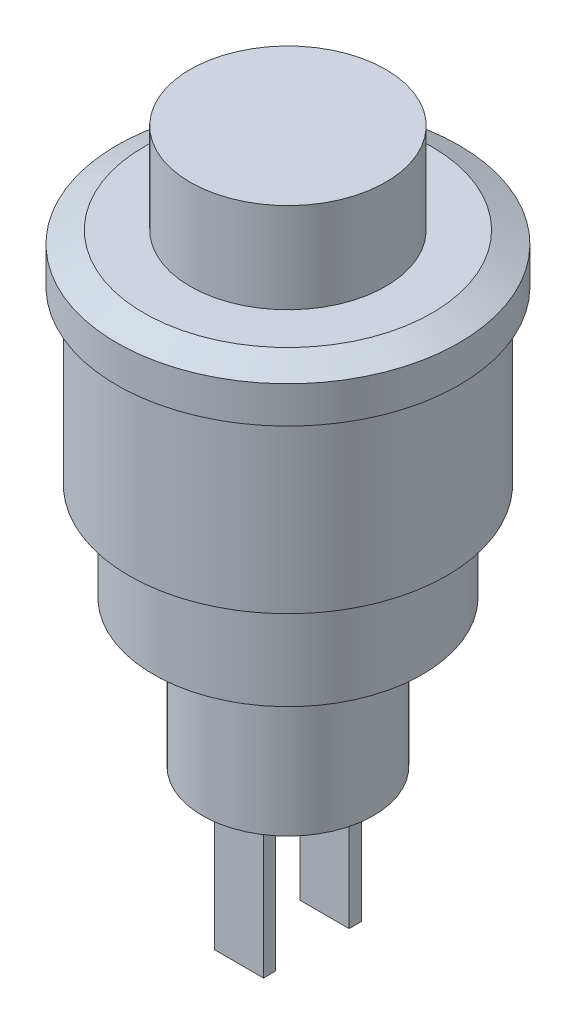
ISO-10303-21;
HEADER;
FILE_DESCRIPTION(('STEP AP214'),'2;1');
FILE_NAME('part.step','',(''),(''),'','','');
FILE_SCHEMA(('AUTOMOTIVE_DESIGN { 1 0 10303 214 1 1 1 1 }'));
ENDSEC;
DATA;
#1=APPLICATION_CONTEXT('core data for automotive mechanical design processes');
#2=APPLICATION_PROTOCOL_DEFINITION('international standard','automotive_design',2000,#1);
#3=PRODUCT_CONTEXT('',#1,'mechanical');
#4=PRODUCT('Part','Part','',(#3));
#5=PRODUCT_RELATED_PRODUCT_CATEGORY('part','',(#4));
#6=PRODUCT_DEFINITION_FORMATION('','',#4);
#7=PRODUCT_DEFINITION_CONTEXT('part definition',#1,'design');
#8=PRODUCT_DEFINITION('design','',#6,#7);
#9=PRODUCT_DEFINITION_SHAPE('','',#8);
#10=(LENGTH_UNIT() NAMED_UNIT(*) SI_UNIT(.MILLI.,.METRE.));
#11=(NAMED_UNIT(*) PLANE_ANGLE_UNIT() SI_UNIT($,.RADIAN.));
#12=(NAMED_UNIT(*) SI_UNIT($,.STERADIAN.) SOLID_ANGLE_UNIT());
#13=UNCERTAINTY_MEASURE_WITH_UNIT(LENGTH_MEASURE(1.E-05),#10,'distance_accuracy_value','');
#14=(GEOMETRIC_REPRESENTATION_CONTEXT(3) GLOBAL_UNCERTAINTY_ASSIGNED_CONTEXT((#13)) GLOBAL_UNIT_ASSIGNED_CONTEXT((#10,
#11,#12)) REPRESENTATION_CONTEXT('',''));
#15=CARTESIAN_POINT('',(0.,0.,0.));
#16=DIRECTION('',(0.,0.,1.));
#17=DIRECTION('',(1.,0.,0.));
#18=AXIS2_PLACEMENT_3D('',#15,#16,#17);
#19=CARTESIAN_POINT('',(3.5,0.,0.));
#20=DIRECTION('',(0.,-1.,0.));
#21=DIRECTION('',(0.,0.,-1.));
#22=AXIS2_PLACEMENT_3D('',#19,#20,#21);
#23=PLANE('',#22);
#24=CARTESIAN_POINT('',(0.,0.,0.));
#25=DIRECTION('',(0.,-1.,0.));
#26=DIRECTION('',(0.,0.,-1.));
#27=AXIS2_PLACEMENT_3D('',#24,#25,#26);
#28=CIRCLE('',#27,3.5);
#29=CARTESIAN_POINT('',(0.,0.,-3.5));
#30=VERTEX_POINT('',#29);
#31=EDGE_CURVE('E157',#30,#30,#28,.T.);
#32=ORIENTED_EDGE('',*,*,#31,.T.);
#33=EDGE_LOOP('',(#32));
#34=FACE_BOUND('',#33,.T.);
#35=DIRECTION('',(-1.,0.,0.));
#36=VECTOR('',#35,1.);
#37=CARTESIAN_POINT('',(1.,0.,-1.5));
#38=LINE('',#37,#36);
#39=CARTESIAN_POINT('',(1.,0.,-1.5));
#40=VERTEX_POINT('',#39);
#41=CARTESIAN_POINT('',(-1.,0.,-1.5));
#42=VERTEX_POINT('',#41);
#43=EDGE_CURVE('E129',#40,#42,#38,.T.);
#44=ORIENTED_EDGE('',*,*,#43,.F.);
#45=DIRECTION('',(0.,0.,1.));
#46=VECTOR('',#45,1.);
#47=CARTESIAN_POINT('',(1.,0.,-1.5));
#48=LINE('',#47,#46);
#49=CARTESIAN_POINT('',(1.,0.,-2.));
#50=VERTEX_POINT('',#49);
#51=EDGE_CURVE('E126',#50,#40,#48,.T.);
#52=ORIENTED_EDGE('',*,*,#51,.F.);
#53=DIRECTION('',(1.,0.,0.));
#54=VECTOR('',#53,1.);
#55=CARTESIAN_POINT('',(1.,0.,-2.));
#56=LINE('',#55,#54);
#57=CARTESIAN_POINT('',(-1.,0.,-2.));
#58=VERTEX_POINT('',#57);
#59=EDGE_CURVE('E138',#58,#50,#56,.T.);
#60=ORIENTED_EDGE('',*,*,#59,.F.);
#61=DIRECTION('',(0.,0.,-1.));
#62=VECTOR('',#61,1.);
#63=CARTESIAN_POINT('',(-1.,0.,-1.5));
#64=LINE('',#63,#62);
#65=EDGE_CURVE('E146',#42,#58,#64,.T.);
#66=ORIENTED_EDGE('',*,*,#65,.F.);
#67=EDGE_LOOP('',(#44,#52,#60,#66));
#68=FACE_BOUND('',#67,.T.);
#69=DIRECTION('',(-1.,0.,0.));
#70=VECTOR('',#69,1.);
#71=CARTESIAN_POINT('',(1.,0.,2.));
#72=LINE('',#71,#70);
#73=CARTESIAN_POINT('',(1.,0.,2.));
#74=VERTEX_POINT('',#73);
#75=CARTESIAN_POINT('',(-1.,0.,2.));
#76=VERTEX_POINT('',#75);
#77=EDGE_CURVE('E424',#74,#76,#72,.T.);
#78=ORIENTED_EDGE('',*,*,#77,.F.);
#79=DIRECTION('',(0.,0.,1.));
#80=VECTOR('',#79,1.);
#81=CARTESIAN_POINT('',(1.,0.,1.5));
#82=LINE('',#81,#80);
#83=CARTESIAN_POINT('',(1.,0.,1.5));
#84=VERTEX_POINT('',#83);
#85=EDGE_CURVE('E124',#84,#74,#82,.T.);
#86=ORIENTED_EDGE('',*,*,#85,.F.);
#87=DIRECTION('',(1.,0.,0.));
#88=VECTOR('',#87,1.);
#89=CARTESIAN_POINT('',(1.,0.,1.5));
#90=LINE('',#89,#88);
#91=CARTESIAN_POINT('',(-1.,0.,1.5));
#92=VERTEX_POINT('',#91);
#93=EDGE_CURVE('E120',#92,#84,#90,.T.);
#94=ORIENTED_EDGE('',*,*,#93,.F.);
#95=DIRECTION('',(0.,0.,-1.));
#96=VECTOR('',#95,1.);
#97=CARTESIAN_POINT('',(-1.,0.,1.5));
#98=LINE('',#97,#96);
#99=EDGE_CURVE('E421',#76,#92,#98,.T.);
#100=ORIENTED_EDGE('',*,*,#99,.F.);
#101=EDGE_LOOP('',(#78,#86,#94,#100));
#102=FACE_BOUND('',#101,.T.);
#103=ADVANCED_FACE('F35',(#34,#68,#102),#23,.T.);
#104=CARTESIAN_POINT('',(0.,22.6897645130844,0.));
#105=DIRECTION('',(0.,1.,0.));
#106=DIRECTION('',(0.,0.,1.));
#107=AXIS2_PLACEMENT_3D('',#104,#105,#106);
#108=PLANE('',#107);
#109=CARTESIAN_POINT('',(0.,22.6897645130844,0.));
#110=DIRECTION('',(0.,-1.,0.));
#111=DIRECTION('',(0.,0.,-1.));
#112=AXIS2_PLACEMENT_3D('',#109,#110,#111);
#113=CIRCLE('',#112,4.);
#114=CARTESIAN_POINT('',(0.,22.6897645130844,-4.));
#115=VERTEX_POINT('',#114);
#116=EDGE_CURVE('E11',#115,#115,#113,.T.);
#117=ORIENTED_EDGE('',*,*,#116,.F.);
#118=EDGE_LOOP('',(#117));
#119=FACE_BOUND('',#118,.T.);
#120=ADVANCED_FACE('F37',(#119),#108,.T.);
#121=CARTESIAN_POINT('',(0.,0.,0.));
#122=DIRECTION('',(0.,-1.,0.));
#123=DIRECTION('',(0.,0.,-1.));
#124=AXIS2_PLACEMENT_3D('',#121,#122,#123);
#125=CYLINDRICAL_SURFACE('',#124,4.);
#126=ORIENTED_EDGE('',*,*,#116,.T.);
#127=EDGE_LOOP('',(#126));
#128=FACE_BOUND('',#127,.T.);
#129=CARTESIAN_POINT('',(0.,19.,0.));
#130=DIRECTION('',(0.,-1.,0.));
#131=DIRECTION('',(0.,0.,-1.));
#132=AXIS2_PLACEMENT_3D('',#129,#130,#131);
#133=CIRCLE('',#132,4.);
#134=CARTESIAN_POINT('',(0.,19.,-4.));
#135=VERTEX_POINT('',#134);
#136=EDGE_CURVE('E43',#135,#135,#133,.T.);
#137=ORIENTED_EDGE('',*,*,#136,.F.);
#138=EDGE_LOOP('',(#137));
#139=FACE_BOUND('',#138,.T.);
#140=ADVANCED_FACE('F189',(#128,#139),#125,.T.);
#141=CARTESIAN_POINT('',(4.,19.,0.));
#142=DIRECTION('',(0.,1.,0.));
#143=DIRECTION('',(0.,0.,1.));
#144=AXIS2_PLACEMENT_3D('',#141,#142,#143);
#145=PLANE('',#144);
#146=ORIENTED_EDGE('',*,*,#136,.T.);
#147=EDGE_LOOP('',(#146));
#148=FACE_BOUND('',#147,.T.);
#149=CARTESIAN_POINT('',(0.,19.,0.));
#150=DIRECTION('',(0.,-1.,0.));
#151=DIRECTION('',(0.,0.,-1.));
#152=AXIS2_PLACEMENT_3D('',#149,#150,#151);
#153=CIRCLE('',#152,5.89130434782607);
#154=CARTESIAN_POINT('',(0.,19.,-5.89130434782607));
#155=VERTEX_POINT('',#154);
#156=EDGE_CURVE('E181',#155,#155,#153,.T.);
#157=ORIENTED_EDGE('',*,*,#156,.F.);
#158=EDGE_LOOP('',(#157));
#159=FACE_BOUND('',#158,.T.);
#160=ADVANCED_FACE('F186',(#148,#159),#145,.T.);
#161=CARTESIAN_POINT('',(0.,18.5,0.));
#162=DIRECTION('',(0.,-1.,0.));
#163=DIRECTION('',(0.,0.,-1.));
#164=AXIS2_PLACEMENT_3D('',#161,#162,#163);
#165=CONICAL_SURFACE('',#164,7.,1.14712740491739);
#166=ORIENTED_EDGE('',*,*,#156,.T.);
#167=EDGE_LOOP('',(#166));
#168=FACE_BOUND('',#167,.T.);
#169=CARTESIAN_POINT('',(0.,18.5,0.));
#170=DIRECTION('',(0.,-1.,0.));
#171=DIRECTION('',(0.,0.,-1.));
#172=AXIS2_PLACEMENT_3D('',#169,#170,#171);
#173=CIRCLE('',#172,7.);
#174=CARTESIAN_POINT('',(0.,18.5,-7.));
#175=VERTEX_POINT('',#174);
#176=EDGE_CURVE('E178',#175,#175,#173,.T.);
#177=ORIENTED_EDGE('',*,*,#176,.F.);
#178=EDGE_LOOP('',(#177));
#179=FACE_BOUND('',#178,.T.);
#180=ADVANCED_FACE('F196',(#168,#179),#165,.T.);
#181=CARTESIAN_POINT('',(0.,0.,0.));
#182=DIRECTION('',(0.,-1.,0.));
#183=DIRECTION('',(0.,0.,-1.));
#184=AXIS2_PLACEMENT_3D('',#181,#182,#183);
#185=CYLINDRICAL_SURFACE('',#184,7.);
#186=ORIENTED_EDGE('',*,*,#176,.T.);
#187=EDGE_LOOP('',(#186));
#188=FACE_BOUND('',#187,.T.);
#189=CARTESIAN_POINT('',(0.,17.,0.));
#190=DIRECTION('',(0.,-1.,0.));
#191=DIRECTION('',(0.,0.,-1.));
#192=AXIS2_PLACEMENT_3D('',#189,#190,#191);
#193=CIRCLE('',#192,7.);
#194=CARTESIAN_POINT('',(0.,17.,-7.));
#195=VERTEX_POINT('',#194);
#196=EDGE_CURVE('E175',#195,#195,#193,.T.);
#197=ORIENTED_EDGE('',*,*,#196,.F.);
#198=EDGE_LOOP('',(#197));
#199=FACE_BOUND('',#198,.T.);
#200=ADVANCED_FACE('F232',(#188,#199),#185,.T.);
#201=CARTESIAN_POINT('',(7.,17.,0.));
#202=DIRECTION('',(0.,-1.,0.));
#203=DIRECTION('',(0.,0.,-1.));
#204=AXIS2_PLACEMENT_3D('',#201,#202,#203);
#205=PLANE('',#204);
#206=ORIENTED_EDGE('',*,*,#196,.T.);
#207=EDGE_LOOP('',(#206));
#208=FACE_BOUND('',#207,.T.);
#209=CARTESIAN_POINT('',(0.,17.,0.));
#210=DIRECTION('',(0.,-1.,0.));
#211=DIRECTION('',(0.,0.,-1.));
#212=AXIS2_PLACEMENT_3D('',#209,#210,#211);
#213=CIRCLE('',#212,6.5);
#214=CARTESIAN_POINT('',(0.,17.,-6.5));
#215=VERTEX_POINT('',#214);
#216=EDGE_CURVE('E172',#215,#215,#213,.T.);
#217=ORIENTED_EDGE('',*,*,#216,.F.);
#218=EDGE_LOOP('',(#217));
#219=FACE_BOUND('',#218,.T.);
#220=ADVANCED_FACE('F228',(#208,#219),#205,.T.);
#221=CARTESIAN_POINT('',(0.,0.,0.));
#222=DIRECTION('',(0.,-1.,0.));
#223=DIRECTION('',(0.,0.,-1.));
#224=AXIS2_PLACEMENT_3D('',#221,#222,#223);
#225=CYLINDRICAL_SURFACE('',#224,6.5);
#226=ORIENTED_EDGE('',*,*,#216,.T.);
#227=EDGE_LOOP('',(#226));
#228=FACE_BOUND('',#227,.T.);
#229=CARTESIAN_POINT('',(0.,10.,0.));
#230=DIRECTION('',(0.,-1.,0.));
#231=DIRECTION('',(0.,0.,-1.));
#232=AXIS2_PLACEMENT_3D('',#229,#230,#231);
#233=CIRCLE('',#232,6.5);
#234=CARTESIAN_POINT('',(0.,10.,-6.5));
#235=VERTEX_POINT('',#234);
#236=EDGE_CURVE('E169',#235,#235,#233,.T.);
#237=ORIENTED_EDGE('',*,*,#236,.F.);
#238=EDGE_LOOP('',(#237));
#239=FACE_BOUND('',#238,.T.);
#240=ADVANCED_FACE('F224',(#228,#239),#225,.T.);
#241=CARTESIAN_POINT('',(6.5,10.,0.));
#242=DIRECTION('',(0.,-1.,0.));
#243=DIRECTION('',(0.,0.,-1.));
#244=AXIS2_PLACEMENT_3D('',#241,#242,#243);
#245=PLANE('',#244);
#246=ORIENTED_EDGE('',*,*,#236,.T.);
#247=EDGE_LOOP('',(#246));
#248=FACE_BOUND('',#247,.T.);
#249=CARTESIAN_POINT('',(0.,10.,0.));
#250=DIRECTION('',(0.,-1.,0.));
#251=DIRECTION('',(0.,0.,-1.));
#252=AXIS2_PLACEMENT_3D('',#249,#250,#251);
#253=CIRCLE('',#252,5.5);
#254=CARTESIAN_POINT('',(0.,10.,-5.5));
#255=VERTEX_POINT('',#254);
#256=EDGE_CURVE('E166',#255,#255,#253,.T.);
#257=ORIENTED_EDGE('',*,*,#256,.F.);
#258=EDGE_LOOP('',(#257));
#259=FACE_BOUND('',#258,.T.);
#260=ADVANCED_FACE('F220',(#248,#259),#245,.T.);
#261=CARTESIAN_POINT('',(0.,0.,0.));
#262=DIRECTION('',(0.,-1.,0.));
#263=DIRECTION('',(0.,0.,-1.));
#264=AXIS2_PLACEMENT_3D('',#261,#262,#263);
#265=CYLINDRICAL_SURFACE('',#264,5.5);
#266=ORIENTED_EDGE('',*,*,#256,.T.);
#267=EDGE_LOOP('',(#266));
#268=FACE_BOUND('',#267,.T.);
#269=CARTESIAN_POINT('',(0.,6.,0.));
#270=DIRECTION('',(0.,-1.,0.));
#271=DIRECTION('',(0.,0.,-1.));
#272=AXIS2_PLACEMENT_3D('',#269,#270,#271);
#273=CIRCLE('',#272,5.5);
#274=CARTESIAN_POINT('',(0.,6.,-5.5));
#275=VERTEX_POINT('',#274);
#276=EDGE_CURVE('E163',#275,#275,#273,.T.);
#277=ORIENTED_EDGE('',*,*,#276,.F.);
#278=EDGE_LOOP('',(#277));
#279=FACE_BOUND('',#278,.T.);
#280=ADVANCED_FACE('F216',(#268,#279),#265,.T.);
#281=CARTESIAN_POINT('',(5.5,6.,0.));
#282=DIRECTION('',(0.,-1.,0.));
#283=DIRECTION('',(0.,0.,-1.));
#284=AXIS2_PLACEMENT_3D('',#281,#282,#283);
#285=PLANE('',#284);
#286=ORIENTED_EDGE('',*,*,#276,.T.);
#287=EDGE_LOOP('',(#286));
#288=FACE_BOUND('',#287,.T.);
#289=CARTESIAN_POINT('',(0.,6.,0.));
#290=DIRECTION('',(0.,-1.,0.));
#291=DIRECTION('',(0.,0.,-1.));
#292=AXIS2_PLACEMENT_3D('',#289,#290,#291);
#293=CIRCLE('',#292,3.5);
#294=CARTESIAN_POINT('',(0.,6.,-3.5));
#295=VERTEX_POINT('',#294);
#296=EDGE_CURVE('E160',#295,#295,#293,.T.);
#297=ORIENTED_EDGE('',*,*,#296,.F.);
#298=EDGE_LOOP('',(#297));
#299=FACE_BOUND('',#298,.T.);
#300=ADVANCED_FACE('F212',(#288,#299),#285,.T.);
#301=CARTESIAN_POINT('',(0.,0.,0.));
#302=DIRECTION('',(0.,-1.,0.));
#303=DIRECTION('',(0.,0.,-1.));
#304=AXIS2_PLACEMENT_3D('',#301,#302,#303);
#305=CYLINDRICAL_SURFACE('',#304,3.5);
#306=ORIENTED_EDGE('',*,*,#296,.T.);
#307=EDGE_LOOP('',(#306));
#308=FACE_BOUND('',#307,.T.);
#309=ORIENTED_EDGE('',*,*,#31,.F.);
#310=EDGE_LOOP('',(#309));
#311=FACE_BOUND('',#310,.T.);
#312=ADVANCED_FACE('F209',(#308,#311),#305,.T.);
#313=CARTESIAN_POINT('',(1.,-6.,-1.5));
#314=DIRECTION('',(-1.,0.,0.));
#315=DIRECTION('',(0.,0.,1.));
#316=AXIS2_PLACEMENT_3D('',#313,#314,#315);
#317=PLANE('',#316);
#318=ORIENTED_EDGE('',*,*,#51,.T.);
#319=DIRECTION('',(0.,1.,0.));
#320=VECTOR('',#319,1.);
#321=CARTESIAN_POINT('',(1.,-6.,-1.5));
#322=LINE('',#321,#320);
#323=CARTESIAN_POINT('',(1.,-6.,-1.5));
#324=VERTEX_POINT('',#323);
#325=EDGE_CURVE('E155',#324,#40,#322,.T.);
#326=ORIENTED_EDGE('',*,*,#325,.F.);
#327=DIRECTION('',(0.,0.,1.));
#328=VECTOR('',#327,1.);
#329=CARTESIAN_POINT('',(1.,-6.,-1.5));
#330=LINE('',#329,#328);
#331=CARTESIAN_POINT('',(1.,-6.,-2.));
#332=VERTEX_POINT('',#331);
#333=EDGE_CURVE('E134',#332,#324,#330,.T.);
#334=ORIENTED_EDGE('',*,*,#333,.F.);
#335=DIRECTION('',(0.,1.,0.));
#336=VECTOR('',#335,1.);
#337=CARTESIAN_POINT('',(1.,-6.,-2.));
#338=LINE('',#337,#336);
#339=EDGE_CURVE('E143',#332,#50,#338,.T.);
#340=ORIENTED_EDGE('',*,*,#339,.T.);
#341=EDGE_LOOP('',(#318,#326,#334,#340));
#342=FACE_BOUND('',#341,.T.);
#343=ADVANCED_FACE('F207',(#342),#317,.F.);
#344=CARTESIAN_POINT('',(1.,-6.,-1.5));
#345=DIRECTION('',(0.,0.,-1.));
#346=DIRECTION('',(-1.,0.,0.));
#347=AXIS2_PLACEMENT_3D('',#344,#345,#346);
#348=PLANE('',#347);
#349=ORIENTED_EDGE('',*,*,#43,.T.);
#350=DIRECTION('',(0.,1.,0.));
#351=VECTOR('',#350,1.);
#352=CARTESIAN_POINT('',(-1.,-6.,-1.5));
#353=LINE('',#352,#351);
#354=CARTESIAN_POINT('',(-1.,-6.,-1.5));
#355=VERTEX_POINT('',#354);
#356=EDGE_CURVE('E152',#355,#42,#353,.T.);
#357=ORIENTED_EDGE('',*,*,#356,.F.);
#358=DIRECTION('',(-1.,0.,0.));
#359=VECTOR('',#358,1.);
#360=CARTESIAN_POINT('',(1.,-6.,-1.5));
#361=LINE('',#360,#359);
#362=EDGE_CURVE('E137',#324,#355,#361,.T.);
#363=ORIENTED_EDGE('',*,*,#362,.F.);
#364=ORIENTED_EDGE('',*,*,#325,.T.);
#365=EDGE_LOOP('',(#349,#357,#363,#364));
#366=FACE_BOUND('',#365,.T.);
#367=ADVANCED_FACE('F294',(#366),#348,.F.);
#368=CARTESIAN_POINT('',(-1.,-6.,-1.5));
#369=DIRECTION('',(1.,0.,0.));
#370=DIRECTION('',(0.,0.,-1.));
#371=AXIS2_PLACEMENT_3D('',#368,#369,#370);
#372=PLANE('',#371);
#373=ORIENTED_EDGE('',*,*,#65,.T.);
#374=DIRECTION('',(0.,1.,0.));
#375=VECTOR('',#374,1.);
#376=CARTESIAN_POINT('',(-1.,-6.,-2.));
#377=LINE('',#376,#375);
#378=CARTESIAN_POINT('',(-1.,-6.,-2.));
#379=VERTEX_POINT('',#378);
#380=EDGE_CURVE('E58',#379,#58,#377,.T.);
#381=ORIENTED_EDGE('',*,*,#380,.F.);
#382=DIRECTION('',(0.,0.,-1.));
#383=VECTOR('',#382,1.);
#384=CARTESIAN_POINT('',(-1.,-6.,-1.5));
#385=LINE('',#384,#383);
#386=EDGE_CURVE('E140',#355,#379,#385,.T.);
#387=ORIENTED_EDGE('',*,*,#386,.F.);
#388=ORIENTED_EDGE('',*,*,#356,.T.);
#389=EDGE_LOOP('',(#373,#381,#387,#388));
#390=FACE_BOUND('',#389,.T.);
#391=ADVANCED_FACE('F301',(#390),#372,.F.);
#392=CARTESIAN_POINT('',(1.,-6.,-2.));
#393=DIRECTION('',(0.,0.,1.));
#394=DIRECTION('',(1.,0.,0.));
#395=AXIS2_PLACEMENT_3D('',#392,#393,#394);
#396=PLANE('',#395);
#397=ORIENTED_EDGE('',*,*,#59,.T.);
#398=ORIENTED_EDGE('',*,*,#339,.F.);
#399=DIRECTION('',(1.,0.,0.));
#400=VECTOR('',#399,1.);
#401=CARTESIAN_POINT('',(1.,-6.,-2.));
#402=LINE('',#401,#400);
#403=EDGE_CURVE('E142',#379,#332,#402,.T.);
#404=ORIENTED_EDGE('',*,*,#403,.F.);
#405=ORIENTED_EDGE('',*,*,#380,.T.);
#406=EDGE_LOOP('',(#397,#398,#404,#405));
#407=FACE_BOUND('',#406,.T.);
#408=ADVANCED_FACE('F308',(#407),#396,.F.);
#409=CARTESIAN_POINT('',(0.,-6.,0.));
#410=DIRECTION('',(0.,1.,0.));
#411=DIRECTION('',(0.,0.,1.));
#412=AXIS2_PLACEMENT_3D('',#409,#410,#411);
#413=PLANE('',#412);
#414=ORIENTED_EDGE('',*,*,#333,.T.);
#415=ORIENTED_EDGE('',*,*,#362,.T.);
#416=ORIENTED_EDGE('',*,*,#386,.T.);
#417=ORIENTED_EDGE('',*,*,#403,.T.);
#418=EDGE_LOOP('',(#414,#415,#416,#417));
#419=FACE_BOUND('',#418,.T.);
#420=ADVANCED_FACE('F316',(#419),#413,.F.);
#421=CARTESIAN_POINT('',(1.,-6.,1.5));
#422=DIRECTION('',(-1.,0.,0.));
#423=DIRECTION('',(0.,0.,1.));
#424=AXIS2_PLACEMENT_3D('',#421,#422,#423);
#425=PLANE('',#424);
#426=ORIENTED_EDGE('',*,*,#85,.T.);
#427=DIRECTION('',(0.,1.,0.));
#428=VECTOR('',#427,1.);
#429=CARTESIAN_POINT('',(1.,-6.,2.));
#430=LINE('',#429,#428);
#431=CARTESIAN_POINT('',(1.,-6.,2.));
#432=VERTEX_POINT('',#431);
#433=EDGE_CURVE('E105',#432,#74,#430,.T.);
#434=ORIENTED_EDGE('',*,*,#433,.F.);
#435=DIRECTION('',(0.,0.,1.));
#436=VECTOR('',#435,1.);
#437=CARTESIAN_POINT('',(1.,-6.,1.5));
#438=LINE('',#437,#436);
#439=CARTESIAN_POINT('',(1.,-6.,1.5));
#440=VERTEX_POINT('',#439);
#441=EDGE_CURVE('E112',#440,#432,#438,.T.);
#442=ORIENTED_EDGE('',*,*,#441,.F.);
#443=DIRECTION('',(0.,1.,0.));
#444=VECTOR('',#443,1.);
#445=CARTESIAN_POINT('',(1.,-6.,1.5));
#446=LINE('',#445,#444);
#447=EDGE_CURVE('E418',#440,#84,#446,.T.);
#448=ORIENTED_EDGE('',*,*,#447,.T.);
#449=EDGE_LOOP('',(#426,#434,#442,#448));
#450=FACE_BOUND('',#449,.T.);
#451=ADVANCED_FACE('F122',(#450),#425,.F.);
#452=CARTESIAN_POINT('',(1.,-6.,2.));
#453=DIRECTION('',(0.,0.,-1.));
#454=DIRECTION('',(-1.,0.,0.));
#455=AXIS2_PLACEMENT_3D('',#452,#453,#454);
#456=PLANE('',#455);
#457=ORIENTED_EDGE('',*,*,#77,.T.);
#458=DIRECTION('',(0.,1.,0.));
#459=VECTOR('',#458,1.);
#460=CARTESIAN_POINT('',(-1.,-6.,2.));
#461=LINE('',#460,#459);
#462=CARTESIAN_POINT('',(-1.,-6.,2.));
#463=VERTEX_POINT('',#462);
#464=EDGE_CURVE('E108',#463,#76,#461,.T.);
#465=ORIENTED_EDGE('',*,*,#464,.F.);
#466=DIRECTION('',(-1.,0.,0.));
#467=VECTOR('',#466,1.);
#468=CARTESIAN_POINT('',(1.,-6.,2.));
#469=LINE('',#468,#467);
#470=EDGE_CURVE('E101',#432,#463,#469,.T.);
#471=ORIENTED_EDGE('',*,*,#470,.F.);
#472=ORIENTED_EDGE('',*,*,#433,.T.);
#473=EDGE_LOOP('',(#457,#465,#471,#472));
#474=FACE_BOUND('',#473,.T.);
#475=ADVANCED_FACE('F103',(#474),#456,.F.);
#476=CARTESIAN_POINT('',(-1.,-6.,1.5));
#477=DIRECTION('',(1.,0.,0.));
#478=DIRECTION('',(0.,0.,-1.));
#479=AXIS2_PLACEMENT_3D('',#476,#477,#478);
#480=PLANE('',#479);
#481=ORIENTED_EDGE('',*,*,#99,.T.);
#482=DIRECTION('',(0.,1.,0.));
#483=VECTOR('',#482,1.);
#484=CARTESIAN_POINT('',(-1.,-6.,1.5));
#485=LINE('',#484,#483);
#486=CARTESIAN_POINT('',(-1.,-6.,1.5));
#487=VERTEX_POINT('',#486);
#488=EDGE_CURVE('E50',#487,#92,#485,.T.);
#489=ORIENTED_EDGE('',*,*,#488,.F.);
#490=DIRECTION('',(0.,0.,-1.));
#491=VECTOR('',#490,1.);
#492=CARTESIAN_POINT('',(-1.,-6.,1.5));
#493=LINE('',#492,#491);
#494=EDGE_CURVE('E111',#463,#487,#493,.T.);
#495=ORIENTED_EDGE('',*,*,#494,.F.);
#496=ORIENTED_EDGE('',*,*,#464,.T.);
#497=EDGE_LOOP('',(#481,#489,#495,#496));
#498=FACE_BOUND('',#497,.T.);
#499=ADVANCED_FACE('F336',(#498),#480,.F.);
#500=CARTESIAN_POINT('',(1.,-6.,1.5));
#501=DIRECTION('',(0.,0.,1.));
#502=DIRECTION('',(1.,0.,0.));
#503=AXIS2_PLACEMENT_3D('',#500,#501,#502);
#504=PLANE('',#503);
#505=ORIENTED_EDGE('',*,*,#93,.T.);
#506=ORIENTED_EDGE('',*,*,#447,.F.);
#507=DIRECTION('',(1.,0.,0.));
#508=VECTOR('',#507,1.);
#509=CARTESIAN_POINT('',(1.,-6.,1.5));
#510=LINE('',#509,#508);
#511=EDGE_CURVE('E116',#487,#440,#510,.T.);
#512=ORIENTED_EDGE('',*,*,#511,.F.);
#513=ORIENTED_EDGE('',*,*,#488,.T.);
#514=EDGE_LOOP('',(#505,#506,#512,#513));
#515=FACE_BOUND('',#514,.T.);
#516=ADVANCED_FACE('F343',(#515),#504,.F.);
#517=CARTESIAN_POINT('',(0.,-6.,0.));
#518=DIRECTION('',(0.,-1.,0.));
#519=DIRECTION('',(0.,0.,-1.));
#520=AXIS2_PLACEMENT_3D('',#517,#518,#519);
#521=PLANE('',#520);
#522=ORIENTED_EDGE('',*,*,#441,.T.);
#523=ORIENTED_EDGE('',*,*,#470,.T.);
#524=ORIENTED_EDGE('',*,*,#494,.T.);
#525=ORIENTED_EDGE('',*,*,#511,.T.);
#526=EDGE_LOOP('',(#522,#523,#524,#525));
#527=FACE_BOUND('',#526,.T.);
#528=ADVANCED_FACE('F115',(#527),#521,.T.);
#529=CLOSED_SHELL('',(#103,#120,#140,#160,#180,#200,#220,#240,#260,#280,#300,#312,#343,#367,
#391,#408,#420,#451,#475,#499,#516,#528));
#530=MANIFOLD_SOLID_BREP('B2',#529);
#531=ADVANCED_BREP_SHAPE_REPRESENTATION('',(#18,#530),#14);
#532=SHAPE_DEFINITION_REPRESENTATION(#9,#531);
ENDSEC;
END-ISO-10303-21;
